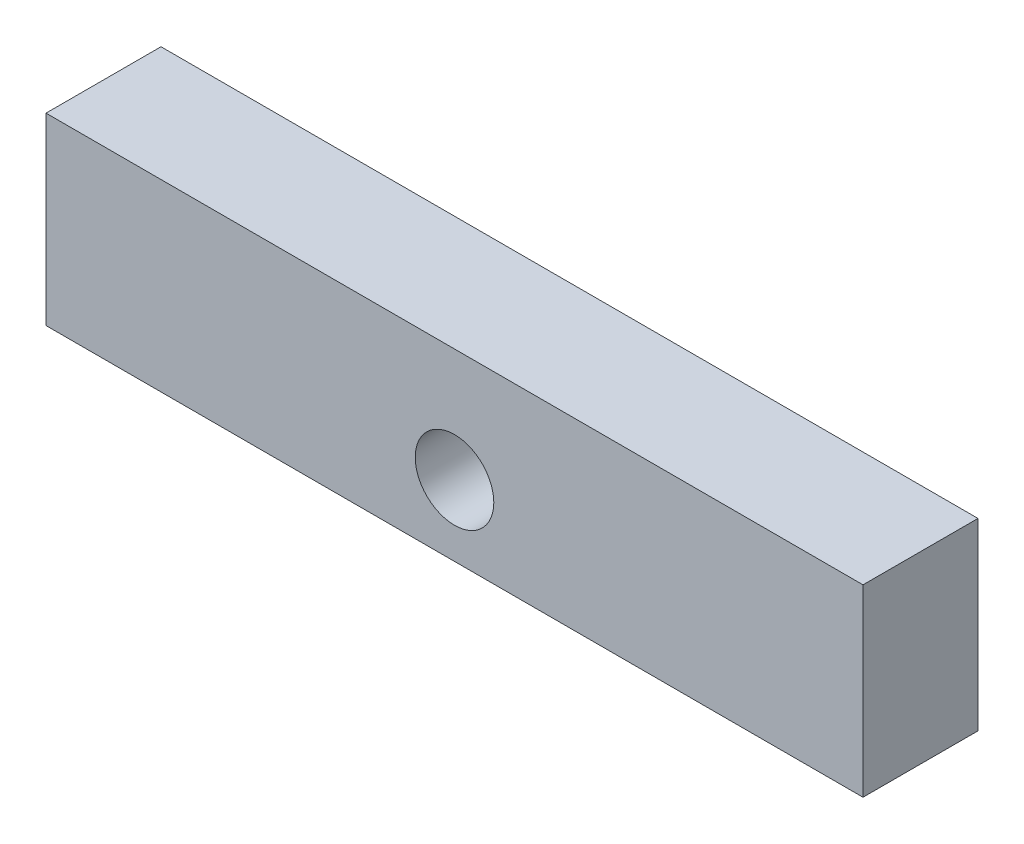
ISO-10303-21;
HEADER;
FILE_DESCRIPTION(('STEP AP214'),'2;1');
FILE_NAME('part.step','',(''),(''),'','','');
FILE_SCHEMA(('AUTOMOTIVE_DESIGN { 1 0 10303 214 1 1 1 1 }'));
ENDSEC;
DATA;
#1=APPLICATION_CONTEXT('core data for automotive mechanical design processes');
#2=APPLICATION_PROTOCOL_DEFINITION('international standard','automotive_design',2000,#1);
#3=PRODUCT_CONTEXT('',#1,'mechanical');
#4=PRODUCT('Part','Part','',(#3));
#5=PRODUCT_RELATED_PRODUCT_CATEGORY('part','',(#4));
#6=PRODUCT_DEFINITION_FORMATION('','',#4);
#7=PRODUCT_DEFINITION_CONTEXT('part definition',#1,'design');
#8=PRODUCT_DEFINITION('design','',#6,#7);
#9=PRODUCT_DEFINITION_SHAPE('','',#8);
#10=(LENGTH_UNIT() NAMED_UNIT(*) SI_UNIT(.MILLI.,.METRE.));
#11=(NAMED_UNIT(*) PLANE_ANGLE_UNIT() SI_UNIT($,.RADIAN.));
#12=(NAMED_UNIT(*) SI_UNIT($,.STERADIAN.) SOLID_ANGLE_UNIT());
#13=UNCERTAINTY_MEASURE_WITH_UNIT(LENGTH_MEASURE(1.E-05),#10,'distance_accuracy_value','');
#14=(GEOMETRIC_REPRESENTATION_CONTEXT(3) GLOBAL_UNCERTAINTY_ASSIGNED_CONTEXT((#13)) GLOBAL_UNIT_ASSIGNED_CONTEXT((#10,
#11,#12)) REPRESENTATION_CONTEXT('',''));
#15=CARTESIAN_POINT('',(0.,0.,0.));
#16=DIRECTION('',(0.,0.,1.));
#17=DIRECTION('',(1.,0.,0.));
#18=AXIS2_PLACEMENT_3D('',#15,#16,#17);
#19=CARTESIAN_POINT('',(-63.977538812135,32.8380287708304,15.));
#20=DIRECTION('',(1.,0.,0.));
#21=DIRECTION('',(0.,0.,-1.));
#22=AXIS2_PLACEMENT_3D('',#19,#20,#21);
#23=PLANE('',#22);
#24=DIRECTION('',(0.,-1.,0.));
#25=VECTOR('',#24,1.);
#26=CARTESIAN_POINT('',(-63.977538812135,32.8380287708304,0.));
#27=LINE('',#26,#25);
#28=CARTESIAN_POINT('',(-63.977538812135,32.8380287708304,0.));
#29=VERTEX_POINT('',#28);
#30=CARTESIAN_POINT('',(-63.977538812135,8.83802877083038,0.));
#31=VERTEX_POINT('',#30);
#32=EDGE_CURVE('E99',#29,#31,#27,.T.);
#33=ORIENTED_EDGE('',*,*,#32,.T.);
#34=DIRECTION('',(0.,0.,-1.));
#35=VECTOR('',#34,1.);
#36=CARTESIAN_POINT('',(-63.977538812135,8.83802877083038,15.));
#37=LINE('',#36,#35);
#38=CARTESIAN_POINT('',(-63.977538812135,8.83802877083038,15.));
#39=VERTEX_POINT('',#38);
#40=EDGE_CURVE('E11',#39,#31,#37,.T.);
#41=ORIENTED_EDGE('',*,*,#40,.F.);
#42=DIRECTION('',(0.,-1.,0.));
#43=VECTOR('',#42,1.);
#44=CARTESIAN_POINT('',(-63.977538812135,32.8380287708304,15.));
#45=LINE('',#44,#43);
#46=CARTESIAN_POINT('',(-63.977538812135,32.8380287708304,15.));
#47=VERTEX_POINT('',#46);
#48=EDGE_CURVE('E87',#47,#39,#45,.T.);
#49=ORIENTED_EDGE('',*,*,#48,.F.);
#50=DIRECTION('',(0.,0.,-1.));
#51=VECTOR('',#50,1.);
#52=CARTESIAN_POINT('',(-63.977538812135,32.8380287708304,15.));
#53=LINE('',#52,#51);
#54=EDGE_CURVE('E95',#47,#29,#53,.T.);
#55=ORIENTED_EDGE('',*,*,#54,.T.);
#56=EDGE_LOOP('',(#33,#41,#49,#55));
#57=FACE_BOUND('',#56,.T.);
#58=ADVANCED_FACE('F36',(#57),#23,.F.);
#59=CARTESIAN_POINT('',(-63.977538812135,8.83802877083038,15.));
#60=DIRECTION('',(0.,1.,0.));
#61=DIRECTION('',(0.,0.,1.));
#62=AXIS2_PLACEMENT_3D('',#59,#60,#61);
#63=PLANE('',#62);
#64=DIRECTION('',(1.,0.,0.));
#65=VECTOR('',#64,1.);
#66=CARTESIAN_POINT('',(-63.977538812135,8.83802877083038,0.));
#67=LINE('',#66,#65);
#68=CARTESIAN_POINT('',(42.592461187865,8.83802877083038,0.));
#69=VERTEX_POINT('',#68);
#70=EDGE_CURVE('E91',#31,#69,#67,.T.);
#71=ORIENTED_EDGE('',*,*,#70,.T.);
#72=DIRECTION('',(0.,0.,-1.));
#73=VECTOR('',#72,1.);
#74=CARTESIAN_POINT('',(42.592461187865,8.83802877083038,15.));
#75=LINE('',#74,#73);
#76=CARTESIAN_POINT('',(42.592461187865,8.83802877083038,15.));
#77=VERTEX_POINT('',#76);
#78=EDGE_CURVE('E44',#77,#69,#75,.T.);
#79=ORIENTED_EDGE('',*,*,#78,.F.);
#80=DIRECTION('',(1.,0.,0.));
#81=VECTOR('',#80,1.);
#82=CARTESIAN_POINT('',(-63.977538812135,8.83802877083038,15.));
#83=LINE('',#82,#81);
#84=EDGE_CURVE('E82',#39,#77,#83,.T.);
#85=ORIENTED_EDGE('',*,*,#84,.F.);
#86=ORIENTED_EDGE('',*,*,#40,.T.);
#87=EDGE_LOOP('',(#71,#79,#85,#86));
#88=FACE_BOUND('',#87,.T.);
#89=ADVANCED_FACE('F90',(#88),#63,.F.);
#90=CARTESIAN_POINT('',(42.592461187865,32.8380287708304,15.));
#91=DIRECTION('',(-1.,0.,0.));
#92=DIRECTION('',(0.,-1.,0.));
#93=AXIS2_PLACEMENT_3D('',#90,#91,#92);
#94=PLANE('',#93);
#95=DIRECTION('',(0.,1.,0.));
#96=VECTOR('',#95,1.);
#97=CARTESIAN_POINT('',(42.592461187865,32.8380287708304,0.));
#98=LINE('',#97,#96);
#99=CARTESIAN_POINT('',(42.592461187865,32.8380287708304,0.));
#100=VERTEX_POINT('',#99);
#101=EDGE_CURVE('E69',#69,#100,#98,.T.);
#102=ORIENTED_EDGE('',*,*,#101,.T.);
#103=DIRECTION('',(0.,0.,-1.));
#104=VECTOR('',#103,1.);
#105=CARTESIAN_POINT('',(42.592461187865,32.8380287708304,15.));
#106=LINE('',#105,#104);
#107=CARTESIAN_POINT('',(42.592461187865,32.8380287708304,15.));
#108=VERTEX_POINT('',#107);
#109=EDGE_CURVE('E92',#108,#100,#106,.T.);
#110=ORIENTED_EDGE('',*,*,#109,.F.);
#111=DIRECTION('',(0.,1.,0.));
#112=VECTOR('',#111,1.);
#113=CARTESIAN_POINT('',(42.592461187865,32.8380287708304,15.));
#114=LINE('',#113,#112);
#115=EDGE_CURVE('E85',#77,#108,#114,.T.);
#116=ORIENTED_EDGE('',*,*,#115,.F.);
#117=ORIENTED_EDGE('',*,*,#78,.T.);
#118=EDGE_LOOP('',(#102,#110,#116,#117));
#119=FACE_BOUND('',#118,.T.);
#120=ADVANCED_FACE('F93',(#119),#94,.F.);
#121=CARTESIAN_POINT('',(-63.977538812135,32.8380287708304,15.));
#122=DIRECTION('',(0.,-1.,0.));
#123=DIRECTION('',(0.,0.,-1.));
#124=AXIS2_PLACEMENT_3D('',#121,#122,#123);
#125=PLANE('',#124);
#126=DIRECTION('',(-1.,0.,0.));
#127=VECTOR('',#126,1.);
#128=CARTESIAN_POINT('',(-63.977538812135,32.8380287708304,0.));
#129=LINE('',#128,#127);
#130=EDGE_CURVE('E75',#100,#29,#129,.T.);
#131=ORIENTED_EDGE('',*,*,#130,.T.);
#132=ORIENTED_EDGE('',*,*,#54,.F.);
#133=DIRECTION('',(-1.,0.,0.));
#134=VECTOR('',#133,1.);
#135=CARTESIAN_POINT('',(-63.977538812135,32.8380287708304,15.));
#136=LINE('',#135,#134);
#137=EDGE_CURVE('E52',#108,#47,#136,.T.);
#138=ORIENTED_EDGE('',*,*,#137,.F.);
#139=ORIENTED_EDGE('',*,*,#109,.T.);
#140=EDGE_LOOP('',(#131,#132,#138,#139));
#141=FACE_BOUND('',#140,.T.);
#142=ADVANCED_FACE('F107',(#141),#125,.F.);
#143=CARTESIAN_POINT('',(0.,0.,15.));
#144=DIRECTION('',(0.,0.,1.));
#145=DIRECTION('',(1.,0.,0.));
#146=AXIS2_PLACEMENT_3D('',#143,#144,#145);
#147=PLANE('',#146);
#148=CARTESIAN_POINT('',(-10.692538812135,18.0493204416343,15.));
#149=DIRECTION('',(0.,0.,1.));
#150=DIRECTION('',(1.,0.,0.));
#151=AXIS2_PLACEMENT_3D('',#148,#149,#150);
#152=CIRCLE('',#151,5.125);
#153=CARTESIAN_POINT('',(-5.56753881213503,18.0493204416343,15.));
#154=VERTEX_POINT('',#153);
#155=EDGE_CURVE('E113',#154,#154,#152,.T.);
#156=ORIENTED_EDGE('',*,*,#155,.F.);
#157=EDGE_LOOP('',(#156));
#158=FACE_BOUND('',#157,.T.);
#159=ORIENTED_EDGE('',*,*,#48,.T.);
#160=ORIENTED_EDGE('',*,*,#84,.T.);
#161=ORIENTED_EDGE('',*,*,#115,.T.);
#162=ORIENTED_EDGE('',*,*,#137,.T.);
#163=EDGE_LOOP('',(#159,#160,#161,#162));
#164=FACE_BOUND('',#163,.T.);
#165=ADVANCED_FACE('F83',(#158,#164),#147,.T.);
#166=CARTESIAN_POINT('',(0.,0.,0.));
#167=DIRECTION('',(0.,0.,1.));
#168=DIRECTION('',(1.,0.,0.));
#169=AXIS2_PLACEMENT_3D('',#166,#167,#168);
#170=PLANE('',#169);
#171=CARTESIAN_POINT('',(-10.692538812135,18.0493204416343,0.));
#172=DIRECTION('',(0.,0.,1.));
#173=DIRECTION('',(1.,0.,0.));
#174=AXIS2_PLACEMENT_3D('',#171,#172,#173);
#175=CIRCLE('',#174,5.125);
#176=CARTESIAN_POINT('',(-5.56753881213503,18.0493204416343,0.));
#177=VERTEX_POINT('',#176);
#178=EDGE_CURVE('E102',#177,#177,#175,.T.);
#179=ORIENTED_EDGE('',*,*,#178,.T.);
#180=EDGE_LOOP('',(#179));
#181=FACE_BOUND('',#180,.T.);
#182=ORIENTED_EDGE('',*,*,#32,.F.);
#183=ORIENTED_EDGE('',*,*,#130,.F.);
#184=ORIENTED_EDGE('',*,*,#101,.F.);
#185=ORIENTED_EDGE('',*,*,#70,.F.);
#186=EDGE_LOOP('',(#182,#183,#184,#185));
#187=FACE_BOUND('',#186,.T.);
#188=ADVANCED_FACE('F110',(#181,#187),#170,.F.);
#189=CARTESIAN_POINT('',(-10.692538812135,18.0493204416343,0.));
#190=DIRECTION('',(0.,0.,1.));
#191=DIRECTION('',(1.,0.,0.));
#192=AXIS2_PLACEMENT_3D('',#189,#190,#191);
#193=CYLINDRICAL_SURFACE('',#192,5.125);
#194=ORIENTED_EDGE('',*,*,#178,.F.);
#195=EDGE_LOOP('',(#194));
#196=FACE_BOUND('',#195,.T.);
#197=ORIENTED_EDGE('',*,*,#155,.T.);
#198=EDGE_LOOP('',(#197));
#199=FACE_BOUND('',#198,.T.);
#200=ADVANCED_FACE('F120',(#196,#199),#193,.F.);
#201=CLOSED_SHELL('',(#58,#89,#120,#142,#165,#188,#200));
#202=MANIFOLD_SOLID_BREP('B2',#201);
#203=ADVANCED_BREP_SHAPE_REPRESENTATION('',(#18,#202),#14);
#204=SHAPE_DEFINITION_REPRESENTATION(#9,#203);
ENDSEC;
END-ISO-10303-21;
